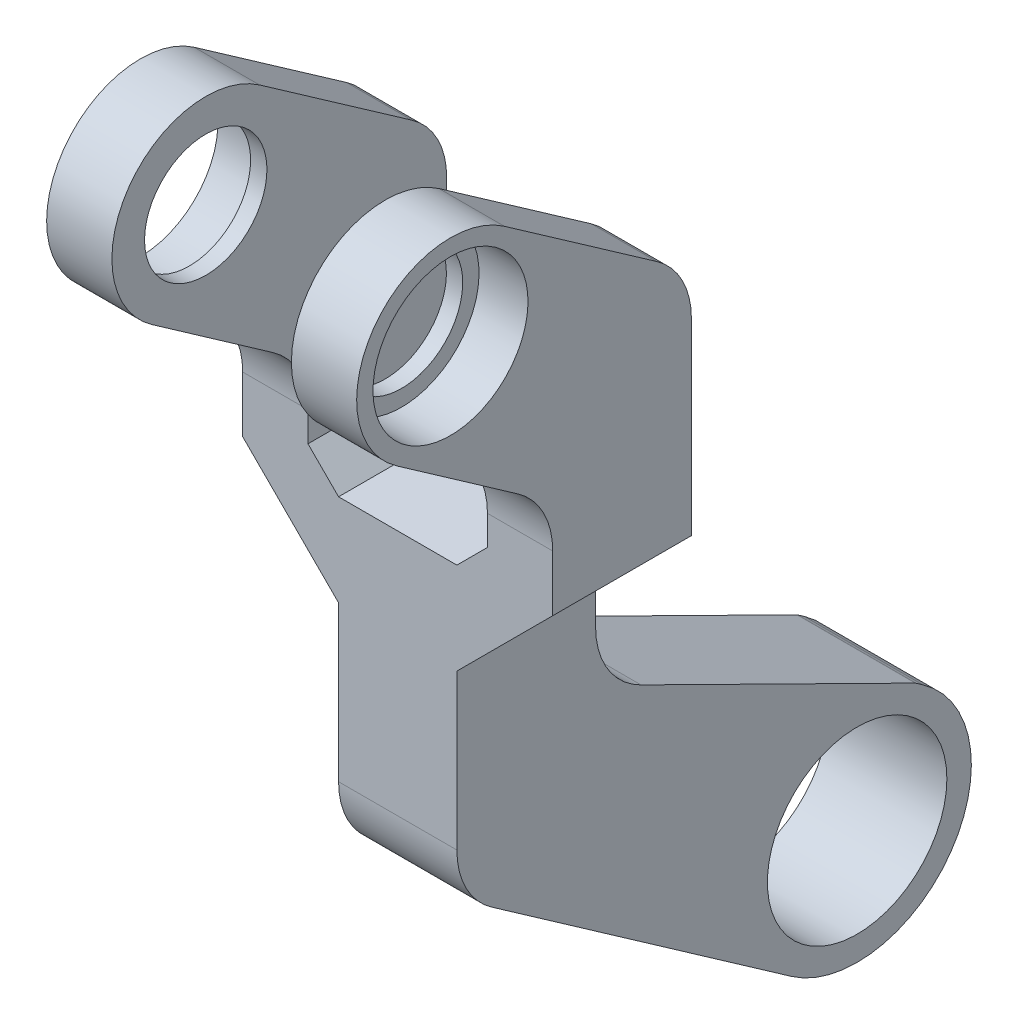
ISO-10303-21;
HEADER;
FILE_DESCRIPTION(('STEP AP214'),'2;1');
FILE_NAME('part.step','',(''),(''),'','','');
FILE_SCHEMA(('AUTOMOTIVE_DESIGN { 1 0 10303 214 1 1 1 1 }'));
ENDSEC;
DATA;
#1=APPLICATION_CONTEXT('core data for automotive mechanical design processes');
#2=APPLICATION_PROTOCOL_DEFINITION('international standard','automotive_design',2000,#1);
#3=PRODUCT_CONTEXT('',#1,'mechanical');
#4=PRODUCT('Part','Part','',(#3));
#5=PRODUCT_RELATED_PRODUCT_CATEGORY('part','',(#4));
#6=PRODUCT_DEFINITION_FORMATION('','',#4);
#7=PRODUCT_DEFINITION_CONTEXT('part definition',#1,'design');
#8=PRODUCT_DEFINITION('design','',#6,#7);
#9=PRODUCT_DEFINITION_SHAPE('','',#8);
#10=(LENGTH_UNIT() NAMED_UNIT(*) SI_UNIT(.MILLI.,.METRE.));
#11=(NAMED_UNIT(*) PLANE_ANGLE_UNIT() SI_UNIT($,.RADIAN.));
#12=(NAMED_UNIT(*) SI_UNIT($,.STERADIAN.) SOLID_ANGLE_UNIT());
#13=UNCERTAINTY_MEASURE_WITH_UNIT(LENGTH_MEASURE(1.E-05),#10,'distance_accuracy_value','');
#14=(GEOMETRIC_REPRESENTATION_CONTEXT(3) GLOBAL_UNCERTAINTY_ASSIGNED_CONTEXT((#13)) GLOBAL_UNIT_ASSIGNED_CONTEXT((#10,
#11,#12)) REPRESENTATION_CONTEXT('',''));
#15=CARTESIAN_POINT('',(0.,0.,0.));
#16=DIRECTION('',(0.,0.,1.));
#17=DIRECTION('',(1.,0.,0.));
#18=AXIS2_PLACEMENT_3D('',#15,#16,#17);
#19=CARTESIAN_POINT('',(-11.75,66.639891708506,29.5323862581288));
#20=DIRECTION('',(1.,0.,0.));
#21=DIRECTION('',(0.,1.,0.));
#22=AXIS2_PLACEMENT_3D('',#19,#20,#21);
#23=CYLINDRICAL_SURFACE('',#22,7.5);
#24=CARTESIAN_POINT('',(-3.75,66.639891708506,29.5323862581288));
#25=DIRECTION('',(-1.,0.,0.));
#26=DIRECTION('',(0.,-1.,0.));
#27=AXIS2_PLACEMENT_3D('',#24,#25,#26);
#28=CIRCLE('',#27,7.5);
#29=CARTESIAN_POINT('',(-3.75,59.139891708506,29.5323862581288));
#30=VERTEX_POINT('',#29);
#31=EDGE_CURVE('E322',#30,#30,#28,.F.);
#32=ORIENTED_EDGE('',*,*,#31,.T.);
#33=EDGE_LOOP('',(#32));
#34=FACE_BOUND('',#33,.T.);
#35=CARTESIAN_POINT('',(-5.74999999999999,66.639891708506,29.5323862581288));
#36=DIRECTION('',(-1.,0.,0.));
#37=DIRECTION('',(0.,0.,1.));
#38=AXIS2_PLACEMENT_3D('',#35,#36,#37);
#39=CIRCLE('',#38,7.5);
#40=CARTESIAN_POINT('',(-5.74999999999999,66.639891708506,37.0323862581288));
#41=VERTEX_POINT('',#40);
#42=EDGE_CURVE('E282',#41,#41,#39,.F.);
#43=ORIENTED_EDGE('',*,*,#42,.F.);
#44=EDGE_LOOP('',(#43));
#45=FACE_BOUND('',#44,.T.);
#46=ADVANCED_FACE('F35',(#34,#45),#23,.F.);
#47=CARTESIAN_POINT('',(18.25,66.639891708506,29.5323862581288));
#48=DIRECTION('',(1.,0.,0.));
#49=DIRECTION('',(0.,1.,0.));
#50=AXIS2_PLACEMENT_3D('',#47,#48,#49);
#51=CIRCLE('',#50,7.5);
#52=CARTESIAN_POINT('',(18.25,74.139891708506,29.5323862581288));
#53=VERTEX_POINT('',#52);
#54=EDGE_CURVE('E314',#53,#53,#51,.F.);
#55=ORIENTED_EDGE('',*,*,#54,.T.);
#56=EDGE_LOOP('',(#55));
#57=FACE_BOUND('',#56,.T.);
#58=CARTESIAN_POINT('',(20.25,66.639891708506,29.5323862581288));
#59=DIRECTION('',(1.,0.,0.));
#60=DIRECTION('',(0.,1.,0.));
#61=AXIS2_PLACEMENT_3D('',#58,#59,#60);
#62=CIRCLE('',#61,7.5);
#63=CARTESIAN_POINT('',(20.25,74.139891708506,29.5323862581288));
#64=VERTEX_POINT('',#63);
#65=EDGE_CURVE('E288',#64,#64,#62,.F.);
#66=ORIENTED_EDGE('',*,*,#65,.F.);
#67=EDGE_LOOP('',(#66));
#68=FACE_BOUND('',#67,.T.);
#69=ADVANCED_FACE('F524',(#57,#68),#23,.F.);
#70=CARTESIAN_POINT('',(-57.4788632095706,57.2196431991826,36.1285152761658));
#71=DIRECTION('',(0.,-0.819152044288989,0.57357643635105));
#72=DIRECTION('',(0.,-0.57357643635105,-0.819152044288989));
#73=AXIS2_PLACEMENT_3D('',#70,#71,#72);
#74=PLANE('',#73);
#75=DIRECTION('',(0.,0.57357643635105,0.819152044288989));
#76=VECTOR('',#75,1.);
#77=CARTESIAN_POINT('',(-11.75,57.2196431991826,36.1285152761658));
#78=LINE('',#77,#76);
#79=CARTESIAN_POINT('',(-11.75,46.8115625454241,21.2642356364895));
#80=VERTEX_POINT('',#79);
#81=CARTESIAN_POINT('',(-11.75,57.2196431991826,36.1285152761658));
#82=VERTEX_POINT('',#81);
#83=EDGE_CURVE('E336',#80,#82,#78,.T.);
#84=ORIENTED_EDGE('',*,*,#83,.F.);
#85=DIRECTION('',(1.,0.,0.));
#86=VECTOR('',#85,1.);
#87=CARTESIAN_POINT('',(-57.4788632095706,46.8115625454241,21.2642356364895));
#88=LINE('',#87,#86);
#89=CARTESIAN_POINT('',(-3.75,46.8115625454241,21.2642356364895));
#90=VERTEX_POINT('',#89);
#91=EDGE_CURVE('E444',#80,#90,#88,.T.);
#92=ORIENTED_EDGE('',*,*,#91,.T.);
#93=DIRECTION('',(0.,-0.57357643635105,-0.819152044288989));
#94=VECTOR('',#93,1.);
#95=CARTESIAN_POINT('',(-3.75,57.2196431991826,36.1285152761658));
#96=LINE('',#95,#94);
#97=CARTESIAN_POINT('',(-3.75,57.2196431991826,36.1285152761659));
#98=VERTEX_POINT('',#97);
#99=EDGE_CURVE('E327',#98,#90,#96,.T.);
#100=ORIENTED_EDGE('',*,*,#99,.F.);
#101=DIRECTION('',(1.,0.,0.));
#102=VECTOR('',#101,1.);
#103=CARTESIAN_POINT('',(-57.4788632095706,57.2196431991826,36.1285152761658));
#104=LINE('',#103,#102);
#105=EDGE_CURVE('E339',#82,#98,#104,.T.);
#106=ORIENTED_EDGE('',*,*,#105,.F.);
#107=EDGE_LOOP('',(#84,#92,#100,#106));
#108=FACE_BOUND('',#107,.T.);
#109=ADVANCED_FACE('F503',(#108),#74,.T.);
#110=CARTESIAN_POINT('',(-57.4788632095706,60.,0.));
#111=DIRECTION('',(0.,0.819152044288989,-0.57357643635105));
#112=DIRECTION('',(0.,0.57357643635105,0.819152044288989));
#113=AXIS2_PLACEMENT_3D('',#110,#111,#112);
#114=PLANE('',#113);
#115=DIRECTION('',(0.,0.57357643635105,0.819152044288989));
#116=VECTOR('',#115,1.);
#117=CARTESIAN_POINT('',(-3.75,60.,0.));
#118=LINE('',#117,#116);
#119=CARTESIAN_POINT('',(-3.75,62.9858499373725,4.2642356364895));
#120=VERTEX_POINT('',#119);
#121=CARTESIAN_POINT('',(-3.75,76.0601402178294,22.9362572400917));
#122=VERTEX_POINT('',#121);
#123=EDGE_CURVE('E325',#120,#122,#118,.T.);
#124=ORIENTED_EDGE('',*,*,#123,.F.);
#125=DIRECTION('',(-1.,0.,0.));
#126=VECTOR('',#125,1.);
#127=CARTESIAN_POINT('',(-11.75,62.9858499373725,4.2642356364895));
#128=LINE('',#127,#126);
#129=CARTESIAN_POINT('',(-11.75,62.9858499373725,4.2642356364895));
#130=VERTEX_POINT('',#129);
#131=EDGE_CURVE('E414',#120,#130,#128,.T.);
#132=ORIENTED_EDGE('',*,*,#131,.T.);
#133=DIRECTION('',(0.,-0.57357643635105,-0.819152044288989));
#134=VECTOR('',#133,1.);
#135=CARTESIAN_POINT('',(-11.75,60.,0.));
#136=LINE('',#135,#134);
#137=CARTESIAN_POINT('',(-11.75,76.0601402178294,22.9362572400917));
#138=VERTEX_POINT('',#137);
#139=EDGE_CURVE('E338',#138,#130,#136,.T.);
#140=ORIENTED_EDGE('',*,*,#139,.F.);
#141=DIRECTION('',(1.,0.,0.));
#142=VECTOR('',#141,1.);
#143=CARTESIAN_POINT('',(-57.4788632095706,76.0601402178294,22.9362572400917));
#144=LINE('',#143,#142);
#145=EDGE_CURVE('E348',#138,#122,#144,.T.);
#146=ORIENTED_EDGE('',*,*,#145,.T.);
#147=EDGE_LOOP('',(#124,#132,#140,#146));
#148=FACE_BOUND('',#147,.T.);
#149=ADVANCED_FACE('F490',(#148),#114,.T.);
#150=CARTESIAN_POINT('',(-39.4109233961791,66.639891708506,29.5323862581288));
#151=DIRECTION('',(1.,0.,0.));
#152=DIRECTION('',(0.,1.,0.));
#153=AXIS2_PLACEMENT_3D('',#150,#151,#152);
#154=CYLINDRICAL_SURFACE('',#153,11.5);
#155=CARTESIAN_POINT('',(-3.75,66.639891708506,29.5323862581288));
#156=DIRECTION('',(-1.,0.,0.));
#157=DIRECTION('',(0.,-1.,0.));
#158=AXIS2_PLACEMENT_3D('',#155,#156,#157);
#159=CIRCLE('',#158,11.5);
#160=EDGE_CURVE('E323',#122,#98,#159,.F.);
#161=ORIENTED_EDGE('',*,*,#160,.F.);
#162=ORIENTED_EDGE('',*,*,#145,.F.);
#163=CARTESIAN_POINT('',(-11.75,66.639891708506,29.5323862581288));
#164=DIRECTION('',(1.,0.,0.));
#165=DIRECTION('',(0.,1.,0.));
#166=AXIS2_PLACEMENT_3D('',#163,#164,#165);
#167=CIRCLE('',#166,11.5);
#168=EDGE_CURVE('E331',#82,#138,#167,.F.);
#169=ORIENTED_EDGE('',*,*,#168,.F.);
#170=ORIENTED_EDGE('',*,*,#105,.T.);
#171=EDGE_LOOP('',(#161,#162,#169,#170));
#172=FACE_BOUND('',#171,.T.);
#173=ADVANCED_FACE('F498',(#172),#154,.T.);
#174=CARTESIAN_POINT('',(0.,20.,23.));
#175=DIRECTION('',(1.,0.,0.));
#176=DIRECTION('',(0.,1.,0.));
#177=AXIS2_PLACEMENT_3D('',#174,#175,#176);
#178=PLANE('',#177);
#179=CARTESIAN_POINT('',(0.,-21.4642354068717,-32.0623601512637));
#180=DIRECTION('',(1.,0.,0.));
#181=DIRECTION('',(0.,1.,0.));
#182=AXIS2_PLACEMENT_3D('',#179,#180,#181);
#183=CIRCLE('',#182,11.);
#184=CARTESIAN_POINT('',(0.,-10.4642354068717,-32.0623601512637));
#185=VERTEX_POINT('',#184);
#186=EDGE_CURVE('E295',#185,#185,#183,.F.);
#187=ORIENTED_EDGE('',*,*,#186,.F.);
#188=EDGE_LOOP('',(#187));
#189=FACE_BOUND('',#188,.T.);
#190=DIRECTION('',(0.,0.573576436351038,0.819152044288998));
#191=VECTOR('',#190,1.);
#192=CARTESIAN_POINT('',(0.,0.,23.));
#193=LINE('',#192,#191);
#194=CARTESIAN_POINT('',(0.,-32.9323640269177,-24.0322900423492));
#195=VERTEX_POINT('',#194);
#196=CARTESIAN_POINT('',(0.,-7.18709516663062,12.7357643635104));
#197=VERTEX_POINT('',#196);
#198=EDGE_CURVE('E305',#195,#197,#193,.T.);
#199=ORIENTED_EDGE('',*,*,#198,.T.);
#200=CARTESIAN_POINT('',(0.,1.00442527625935,7.));
#201=DIRECTION('',(1.,0.,0.));
#202=DIRECTION('',(0.,1.,0.));
#203=AXIS2_PLACEMENT_3D('',#200,#201,#202);
#204=CIRCLE('',#203,10.);
#205=CARTESIAN_POINT('',(0.,1.00442527625935,17.));
#206=VERTEX_POINT('',#205);
#207=EDGE_CURVE('E450',#197,#206,#204,.F.);
#208=ORIENTED_EDGE('',*,*,#207,.T.);
#209=DIRECTION('',(0.,1.,0.));
#210=VECTOR('',#209,1.);
#211=CARTESIAN_POINT('',(0.,20.,17.));
#212=LINE('',#211,#210);
#213=CARTESIAN_POINT('',(0.,20.,17.));
#214=VERTEX_POINT('',#213);
#215=EDGE_CURVE('E253',#206,#214,#212,.T.);
#216=ORIENTED_EDGE('',*,*,#215,.T.);
#217=DIRECTION('',(0.,0.,-1.));
#218=VECTOR('',#217,1.);
#219=CARTESIAN_POINT('',(0.,20.,23.));
#220=LINE('',#219,#218);
#221=CARTESIAN_POINT('',(0.,20.,0.));
#222=VERTEX_POINT('',#221);
#223=EDGE_CURVE('E389',#214,#222,#220,.T.);
#224=ORIENTED_EDGE('',*,*,#223,.T.);
#225=DIRECTION('',(0.,-1.,0.));
#226=VECTOR('',#225,1.);
#227=CARTESIAN_POINT('',(0.,20.,0.));
#228=LINE('',#227,#226);
#229=CARTESIAN_POINT('',(0.,16.2121311990158,0.));
#230=VERTEX_POINT('',#229);
#231=EDGE_CURVE('E366',#222,#230,#228,.T.);
#232=ORIENTED_EDGE('',*,*,#231,.T.);
#233=CARTESIAN_POINT('',(0.,16.2121311990158,-10.));
#234=DIRECTION('',(1.,0.,0.));
#235=DIRECTION('',(0.,1.,0.));
#236=AXIS2_PLACEMENT_3D('',#233,#234,#235);
#237=CIRCLE('',#236,10.);
#238=CARTESIAN_POINT('',(0.,7.24740723806097,-5.56900414084125));
#239=VERTEX_POINT('',#238);
#240=EDGE_CURVE('E11',#230,#239,#237,.T.);
#241=ORIENTED_EDGE('',*,*,#240,.T.);
#242=DIRECTION('',(0.,-0.443099585915876,-0.896472396095485));
#243=VECTOR('',#242,1.);
#244=CARTESIAN_POINT('',(0.,21.0995830227714,22.4565088850563));
#245=LINE('',#244,#243);
#246=CARTESIAN_POINT('',(0.,-9.37309394782038,-39.1953513458772));
#247=VERTEX_POINT('',#246);
#248=EDGE_CURVE('E246',#239,#247,#245,.T.);
#249=ORIENTED_EDGE('',*,*,#248,.T.);
#250=CARTESIAN_POINT('',(0.,-21.4642354068717,-32.0623601512637));
#251=DIRECTION('',(1.,0.,0.));
#252=DIRECTION('',(0.,1.,0.));
#253=AXIS2_PLACEMENT_3D('',#250,#251,#252);
#254=CIRCLE('',#253,14.038349802068);
#255=CARTESIAN_POINT('',(0.,-9.40133673911819,-39.2430106020748));
#256=VERTEX_POINT('',#255);
#257=EDGE_CURVE('E236',#247,#256,#254,.F.);
#258=ORIENTED_EDGE('',*,*,#257,.T.);
#259=DIRECTION('',(0.,-0.573576436351037,-0.819152044288998));
#260=VECTOR('',#259,1.);
#261=CARTESIAN_POINT('',(0.,18.0769151064975,0.));
#262=LINE('',#261,#260);
#263=CARTESIAN_POINT('',(0.,-9.99610678682573,-40.0924302601782));
#264=VERTEX_POINT('',#263);
#265=EDGE_CURVE('E303',#256,#264,#262,.T.);
#266=ORIENTED_EDGE('',*,*,#265,.T.);
#267=CARTESIAN_POINT('',(0.,-21.4642354068717,-32.0623601512637));
#268=DIRECTION('',(1.,0.,0.));
#269=DIRECTION('',(0.,1.,0.));
#270=AXIS2_PLACEMENT_3D('',#267,#268,#269);
#271=CIRCLE('',#270,14.);
#272=EDGE_CURVE('E299',#264,#195,#271,.F.);
#273=ORIENTED_EDGE('',*,*,#272,.T.);
#274=EDGE_LOOP('',(#199,#208,#216,#224,#232,#241,#249,#258,#266,#273));
#275=FACE_BOUND('',#274,.T.);
#276=ADVANCED_FACE('F472',(#189,#275),#178,.F.);
#277=CARTESIAN_POINT('',(14.5,0.,23.));
#278=DIRECTION('',(-1.,0.,0.));
#279=DIRECTION('',(0.,-1.,0.));
#280=AXIS2_PLACEMENT_3D('',#277,#278,#279);
#281=PLANE('',#280);
#282=CARTESIAN_POINT('',(14.5,-21.4642354068717,-32.0623601512637));
#283=DIRECTION('',(1.,0.,0.));
#284=DIRECTION('',(0.,0.,-1.));
#285=AXIS2_PLACEMENT_3D('',#282,#283,#284);
#286=CIRCLE('',#285,11.);
#287=CARTESIAN_POINT('',(14.5,-21.4642354068717,-43.0623601512637));
#288=VERTEX_POINT('',#287);
#289=EDGE_CURVE('E292',#288,#288,#286,.T.);
#290=ORIENTED_EDGE('',*,*,#289,.F.);
#291=EDGE_LOOP('',(#290));
#292=FACE_BOUND('',#291,.T.);
#293=DIRECTION('',(0.,-1.,0.));
#294=VECTOR('',#293,1.);
#295=CARTESIAN_POINT('',(14.5,0.,17.));
#296=LINE('',#295,#294);
#297=CARTESIAN_POINT('',(14.5,20.,17.));
#298=VERTEX_POINT('',#297);
#299=CARTESIAN_POINT('',(14.5,1.00442527625935,17.));
#300=VERTEX_POINT('',#299);
#301=EDGE_CURVE('E251',#298,#300,#296,.T.);
#302=ORIENTED_EDGE('',*,*,#301,.T.);
#303=CARTESIAN_POINT('',(14.5,1.00442527625935,7.));
#304=DIRECTION('',(-1.,0.,0.));
#305=DIRECTION('',(0.,-1.,0.));
#306=AXIS2_PLACEMENT_3D('',#303,#304,#305);
#307=CIRCLE('',#306,10.);
#308=CARTESIAN_POINT('',(14.5,-7.18709516663062,12.7357643635104));
#309=VERTEX_POINT('',#308);
#310=EDGE_CURVE('E58',#300,#309,#307,.F.);
#311=ORIENTED_EDGE('',*,*,#310,.T.);
#312=DIRECTION('',(0.,-0.573576436351038,-0.819152044288998));
#313=VECTOR('',#312,1.);
#314=CARTESIAN_POINT('',(14.5,0.,23.));
#315=LINE('',#314,#313);
#316=CARTESIAN_POINT('',(14.5,-32.9323640269177,-24.0322900423492));
#317=VERTEX_POINT('',#316);
#318=EDGE_CURVE('E301',#309,#317,#315,.T.);
#319=ORIENTED_EDGE('',*,*,#318,.T.);
#320=CARTESIAN_POINT('',(14.5,-21.4642354068717,-32.0623601512637));
#321=DIRECTION('',(1.,0.,0.));
#322=DIRECTION('',(0.,0.,1.));
#323=AXIS2_PLACEMENT_3D('',#320,#321,#322);
#324=CIRCLE('',#323,14.);
#325=CARTESIAN_POINT('',(14.5,-9.99610678682573,-40.0924302601782));
#326=VERTEX_POINT('',#325);
#327=EDGE_CURVE('E298',#317,#326,#324,.T.);
#328=ORIENTED_EDGE('',*,*,#327,.T.);
#329=DIRECTION('',(0.,0.573576436351037,0.819152044288998));
#330=VECTOR('',#329,1.);
#331=CARTESIAN_POINT('',(14.5,18.0769151064975,0.));
#332=LINE('',#331,#330);
#333=CARTESIAN_POINT('',(14.5,-9.40133673911815,-39.2430106020747));
#334=VERTEX_POINT('',#333);
#335=EDGE_CURVE('E242',#326,#334,#332,.T.);
#336=ORIENTED_EDGE('',*,*,#335,.T.);
#337=CARTESIAN_POINT('',(14.5,-21.4642354068717,-32.0623601512637));
#338=DIRECTION('',(-1.,0.,0.));
#339=DIRECTION('',(0.,1.,0.));
#340=AXIS2_PLACEMENT_3D('',#337,#338,#339);
#341=CIRCLE('',#340,14.038349802068);
#342=CARTESIAN_POINT('',(14.5,-9.37309394782038,-39.1953513458772));
#343=VERTEX_POINT('',#342);
#344=EDGE_CURVE('E229',#343,#334,#341,.T.);
#345=ORIENTED_EDGE('',*,*,#344,.F.);
#346=DIRECTION('',(0.,-0.443099585915876,-0.896472396095484));
#347=VECTOR('',#346,1.);
#348=CARTESIAN_POINT('',(14.5,9.99999999999999,0.));
#349=LINE('',#348,#347);
#350=CARTESIAN_POINT('',(14.5,7.24740723806098,-5.56900414084124));
#351=VERTEX_POINT('',#350);
#352=EDGE_CURVE('E221',#351,#343,#349,.T.);
#353=ORIENTED_EDGE('',*,*,#352,.F.);
#354=CARTESIAN_POINT('',(14.5,16.2121311990158,-10.));
#355=DIRECTION('',(-1.,0.,0.));
#356=DIRECTION('',(0.,-1.,0.));
#357=AXIS2_PLACEMENT_3D('',#354,#355,#356);
#358=CIRCLE('',#357,10.);
#359=CARTESIAN_POINT('',(14.5,16.2121311990158,0.));
#360=VERTEX_POINT('',#359);
#361=EDGE_CURVE('E43',#351,#360,#358,.T.);
#362=ORIENTED_EDGE('',*,*,#361,.T.);
#363=DIRECTION('',(0.,1.,0.));
#364=VECTOR('',#363,1.);
#365=CARTESIAN_POINT('',(14.5,0.,0.));
#366=LINE('',#365,#364);
#367=CARTESIAN_POINT('',(14.5,20.,0.));
#368=VERTEX_POINT('',#367);
#369=EDGE_CURVE('E371',#360,#368,#366,.T.);
#370=ORIENTED_EDGE('',*,*,#369,.T.);
#371=DIRECTION('',(0.,0.,-1.));
#372=VECTOR('',#371,1.);
#373=CARTESIAN_POINT('',(14.5,20.,23.));
#374=LINE('',#373,#372);
#375=EDGE_CURVE('E401',#298,#368,#374,.T.);
#376=ORIENTED_EDGE('',*,*,#375,.F.);
#377=EDGE_LOOP('',(#302,#311,#319,#328,#336,#345,#353,#362,#370,#376));
#378=FACE_BOUND('',#377,.T.);
#379=ADVANCED_FACE('F239',(#292,#378),#281,.F.);
#380=CARTESIAN_POINT('',(14.5,20.,23.));
#381=DIRECTION('',(-0.707106781186546,0.707106781186549,0.));
#382=DIRECTION('',(-0.707106781186549,-0.707106781186546,0.));
#383=AXIS2_PLACEMENT_3D('',#380,#381,#382);
#384=PLANE('',#383);
#385=DIRECTION('',(0.,0.,-1.));
#386=VECTOR('',#385,1.);
#387=CARTESIAN_POINT('',(26.25,31.75,23.));
#388=LINE('',#387,#386);
#389=CARTESIAN_POINT('',(26.25,31.75,17.));
#390=VERTEX_POINT('',#389);
#391=CARTESIAN_POINT('',(26.25,31.75,0.));
#392=VERTEX_POINT('',#391);
#393=EDGE_CURVE('E399',#390,#392,#388,.T.);
#394=ORIENTED_EDGE('',*,*,#393,.F.);
#395=DIRECTION('',(-0.707106781186549,-0.707106781186546,0.));
#396=VECTOR('',#395,1.);
#397=CARTESIAN_POINT('',(14.5,20.,17.));
#398=LINE('',#397,#396);
#399=EDGE_CURVE('E261',#390,#298,#398,.T.);
#400=ORIENTED_EDGE('',*,*,#399,.T.);
#401=ORIENTED_EDGE('',*,*,#375,.T.);
#402=DIRECTION('',(0.707106781186549,0.707106781186546,0.));
#403=VECTOR('',#402,1.);
#404=CARTESIAN_POINT('',(14.5,20.,0.));
#405=LINE('',#404,#403);
#406=EDGE_CURVE('E373',#368,#392,#405,.T.);
#407=ORIENTED_EDGE('',*,*,#406,.T.);
#408=EDGE_LOOP('',(#394,#400,#401,#407));
#409=FACE_BOUND('',#408,.T.);
#410=ADVANCED_FACE('F577',(#409),#384,.F.);
#411=CARTESIAN_POINT('',(26.25,31.75,23.));
#412=DIRECTION('',(-1.,0.,0.));
#413=DIRECTION('',(0.,-1.,0.));
#414=AXIS2_PLACEMENT_3D('',#411,#412,#413);
#415=PLANE('',#414);
#416=CARTESIAN_POINT('',(26.25,66.639891708506,29.5323862581288));
#417=DIRECTION('',(1.,0.,0.));
#418=DIRECTION('',(0.,1.,0.));
#419=AXIS2_PLACEMENT_3D('',#416,#417,#418);
#420=CIRCLE('',#419,9.50000000000001);
#421=CARTESIAN_POINT('',(26.25,76.139891708506,29.5323862581288));
#422=VERTEX_POINT('',#421);
#423=EDGE_CURVE('E289',#422,#422,#420,.T.);
#424=ORIENTED_EDGE('',*,*,#423,.F.);
#425=EDGE_LOOP('',(#424));
#426=FACE_BOUND('',#425,.T.);
#427=DIRECTION('',(0.,1.,0.));
#428=VECTOR('',#427,1.);
#429=CARTESIAN_POINT('',(26.25,31.75,0.));
#430=LINE('',#429,#428);
#431=CARTESIAN_POINT('',(26.25,54.7943294944826,0.));
#432=VERTEX_POINT('',#431);
#433=EDGE_CURVE('E376',#392,#432,#430,.T.);
#434=ORIENTED_EDGE('',*,*,#433,.T.);
#435=CARTESIAN_POINT('',(26.25,54.7943294944826,10.));
#436=DIRECTION('',(-1.,0.,0.));
#437=DIRECTION('',(0.,-1.,0.));
#438=AXIS2_PLACEMENT_3D('',#435,#436,#437);
#439=CIRCLE('',#438,10.);
#440=CARTESIAN_POINT('',(26.25,62.9858499373725,4.2642356364895));
#441=VERTEX_POINT('',#440);
#442=EDGE_CURVE('E432',#432,#441,#439,.F.);
#443=ORIENTED_EDGE('',*,*,#442,.T.);
#444=DIRECTION('',(0.,0.57357643635105,0.819152044288989));
#445=VECTOR('',#444,1.);
#446=CARTESIAN_POINT('',(26.25,60.,0.));
#447=LINE('',#446,#445);
#448=CARTESIAN_POINT('',(26.25,76.0601402178294,22.9362572400917));
#449=VERTEX_POINT('',#448);
#450=EDGE_CURVE('E333',#441,#449,#447,.T.);
#451=ORIENTED_EDGE('',*,*,#450,.T.);
#452=CARTESIAN_POINT('',(26.25,66.639891708506,29.5323862581288));
#453=DIRECTION('',(1.,0.,0.));
#454=DIRECTION('',(0.,1.,0.));
#455=AXIS2_PLACEMENT_3D('',#452,#453,#454);
#456=CIRCLE('',#455,11.5);
#457=CARTESIAN_POINT('',(26.25,57.2196431991826,36.1285152761658));
#458=VERTEX_POINT('',#457);
#459=EDGE_CURVE('E330',#449,#458,#456,.T.);
#460=ORIENTED_EDGE('',*,*,#459,.T.);
#461=DIRECTION('',(0.,-0.57357643635105,-0.819152044288989));
#462=VECTOR('',#461,1.);
#463=CARTESIAN_POINT('',(26.25,57.2196431991826,36.1285152761658));
#464=LINE('',#463,#462);
#465=CARTESIAN_POINT('',(26.25,46.8115625454241,21.2642356364895));
#466=VERTEX_POINT('',#465);
#467=EDGE_CURVE('E341',#458,#466,#464,.T.);
#468=ORIENTED_EDGE('',*,*,#467,.T.);
#469=CARTESIAN_POINT('',(26.25,38.6200421025342,27.));
#470=DIRECTION('',(-1.,0.,0.));
#471=DIRECTION('',(0.,-1.,0.));
#472=AXIS2_PLACEMENT_3D('',#469,#470,#471);
#473=CIRCLE('',#472,10.);
#474=CARTESIAN_POINT('',(26.25,38.6200421025342,17.));
#475=VERTEX_POINT('',#474);
#476=EDGE_CURVE('E452',#466,#475,#473,.T.);
#477=ORIENTED_EDGE('',*,*,#476,.T.);
#478=DIRECTION('',(0.,1.,0.));
#479=VECTOR('',#478,1.);
#480=CARTESIAN_POINT('',(26.25,43.8257126080516,17.));
#481=LINE('',#480,#479);
#482=EDGE_CURVE('E248',#390,#475,#481,.T.);
#483=ORIENTED_EDGE('',*,*,#482,.F.);
#484=ORIENTED_EDGE('',*,*,#393,.T.);
#485=EDGE_LOOP('',(#434,#443,#451,#460,#468,#477,#483,#484));
#486=FACE_BOUND('',#485,.T.);
#487=ADVANCED_FACE('F573',(#426,#486),#415,.F.);
#488=CARTESIAN_POINT('',(18.25,60.,23.));
#489=DIRECTION('',(1.,0.,0.));
#490=DIRECTION('',(0.,0.,-1.));
#491=AXIS2_PLACEMENT_3D('',#488,#489,#490);
#492=PLANE('',#491);
#493=DIRECTION('',(0.,-0.57357643635105,-0.819152044288989));
#494=VECTOR('',#493,1.);
#495=CARTESIAN_POINT('',(18.25,60.,0.));
#496=LINE('',#495,#494);
#497=CARTESIAN_POINT('',(18.25,76.0601402178294,22.9362572400917));
#498=VERTEX_POINT('',#497);
#499=CARTESIAN_POINT('',(18.25,62.9858499373725,4.2642356364895));
#500=VERTEX_POINT('',#499);
#501=EDGE_CURVE('E317',#498,#500,#496,.T.);
#502=ORIENTED_EDGE('',*,*,#501,.T.);
#503=CARTESIAN_POINT('',(18.25,54.7943294944826,10.));
#504=DIRECTION('',(1.,0.,0.));
#505=DIRECTION('',(0.,0.,-1.));
#506=AXIS2_PLACEMENT_3D('',#503,#504,#505);
#507=CIRCLE('',#506,10.);
#508=CARTESIAN_POINT('',(18.25,54.7943294944826,0.));
#509=VERTEX_POINT('',#508);
#510=EDGE_CURVE('E430',#500,#509,#507,.F.);
#511=ORIENTED_EDGE('',*,*,#510,.T.);
#512=DIRECTION('',(0.,-1.,0.));
#513=VECTOR('',#512,1.);
#514=CARTESIAN_POINT('',(18.25,60.,0.));
#515=LINE('',#514,#513);
#516=CARTESIAN_POINT('',(18.25,35.,0.));
#517=VERTEX_POINT('',#516);
#518=EDGE_CURVE('E379',#509,#517,#515,.T.);
#519=ORIENTED_EDGE('',*,*,#518,.T.);
#520=DIRECTION('',(0.,0.,-1.));
#521=VECTOR('',#520,1.);
#522=CARTESIAN_POINT('',(18.25,35.,23.));
#523=LINE('',#522,#521);
#524=CARTESIAN_POINT('',(18.25,35.,17.));
#525=VERTEX_POINT('',#524);
#526=EDGE_CURVE('E396',#525,#517,#523,.T.);
#527=ORIENTED_EDGE('',*,*,#526,.F.);
#528=DIRECTION('',(0.,1.,0.));
#529=VECTOR('',#528,1.);
#530=CARTESIAN_POINT('',(18.25,60.,17.));
#531=LINE('',#530,#529);
#532=CARTESIAN_POINT('',(18.25,38.6200421025342,17.));
#533=VERTEX_POINT('',#532);
#534=EDGE_CURVE('E275',#525,#533,#531,.T.);
#535=ORIENTED_EDGE('',*,*,#534,.T.);
#536=CARTESIAN_POINT('',(18.25,38.6200421025342,27.));
#537=DIRECTION('',(1.,0.,0.));
#538=DIRECTION('',(0.,0.,-1.));
#539=AXIS2_PLACEMENT_3D('',#536,#537,#538);
#540=CIRCLE('',#539,10.);
#541=CARTESIAN_POINT('',(18.25,46.8115625454241,21.2642356364895));
#542=VERTEX_POINT('',#541);
#543=EDGE_CURVE('E454',#533,#542,#540,.T.);
#544=ORIENTED_EDGE('',*,*,#543,.T.);
#545=DIRECTION('',(0.,0.57357643635105,0.819152044288989));
#546=VECTOR('',#545,1.);
#547=CARTESIAN_POINT('',(18.25,57.2196431991826,36.1285152761658));
#548=LINE('',#547,#546);
#549=CARTESIAN_POINT('',(18.25,57.2196431991826,36.1285152761658));
#550=VERTEX_POINT('',#549);
#551=EDGE_CURVE('E320',#542,#550,#548,.T.);
#552=ORIENTED_EDGE('',*,*,#551,.T.);
#553=CARTESIAN_POINT('',(18.25,66.639891708506,29.5323862581288));
#554=DIRECTION('',(1.,0.,0.));
#555=DIRECTION('',(0.,1.,0.));
#556=AXIS2_PLACEMENT_3D('',#553,#554,#555);
#557=CIRCLE('',#556,11.5);
#558=EDGE_CURVE('E315',#550,#498,#557,.F.);
#559=ORIENTED_EDGE('',*,*,#558,.T.);
#560=EDGE_LOOP('',(#502,#511,#519,#527,#535,#544,#552,#559));
#561=FACE_BOUND('',#560,.T.);
#562=ORIENTED_EDGE('',*,*,#54,.F.);
#563=EDGE_LOOP('',(#562));
#564=FACE_BOUND('',#563,.T.);
#565=ADVANCED_FACE('F570',(#561,#564),#492,.F.);
#566=CARTESIAN_POINT('',(-3.75,35.,23.));
#567=DIRECTION('',(-1.,0.,0.));
#568=DIRECTION('',(0.,0.,1.));
#569=AXIS2_PLACEMENT_3D('',#566,#567,#568);
#570=PLANE('',#569);
#571=DIRECTION('',(0.,1.,0.));
#572=VECTOR('',#571,1.);
#573=CARTESIAN_POINT('',(-3.75,35.,0.));
#574=LINE('',#573,#572);
#575=CARTESIAN_POINT('',(-3.75,35.,0.));
#576=VERTEX_POINT('',#575);
#577=CARTESIAN_POINT('',(-3.75,54.7943294944826,0.));
#578=VERTEX_POINT('',#577);
#579=EDGE_CURVE('E381',#576,#578,#574,.T.);
#580=ORIENTED_EDGE('',*,*,#579,.T.);
#581=CARTESIAN_POINT('',(-3.75,54.7943294944826,10.));
#582=DIRECTION('',(-1.,0.,0.));
#583=DIRECTION('',(0.,0.,1.));
#584=AXIS2_PLACEMENT_3D('',#581,#582,#583);
#585=CIRCLE('',#584,10.);
#586=EDGE_CURVE('E425',#578,#120,#585,.F.);
#587=ORIENTED_EDGE('',*,*,#586,.T.);
#588=ORIENTED_EDGE('',*,*,#123,.T.);
#589=ORIENTED_EDGE('',*,*,#160,.T.);
#590=ORIENTED_EDGE('',*,*,#99,.T.);
#591=CARTESIAN_POINT('',(-3.75,38.6200421025342,27.));
#592=DIRECTION('',(-1.,0.,0.));
#593=DIRECTION('',(0.,0.,1.));
#594=AXIS2_PLACEMENT_3D('',#591,#592,#593);
#595=CIRCLE('',#594,10.);
#596=CARTESIAN_POINT('',(-3.75,38.6200421025342,17.));
#597=VERTEX_POINT('',#596);
#598=EDGE_CURVE('E456',#90,#597,#595,.T.);
#599=ORIENTED_EDGE('',*,*,#598,.T.);
#600=DIRECTION('',(0.,-1.,0.));
#601=VECTOR('',#600,1.);
#602=CARTESIAN_POINT('',(-3.75,35.,17.));
#603=LINE('',#602,#601);
#604=CARTESIAN_POINT('',(-3.75,35.,17.));
#605=VERTEX_POINT('',#604);
#606=EDGE_CURVE('E273',#597,#605,#603,.T.);
#607=ORIENTED_EDGE('',*,*,#606,.T.);
#608=DIRECTION('',(0.,0.,-1.));
#609=VECTOR('',#608,1.);
#610=CARTESIAN_POINT('',(-3.75,35.,23.));
#611=LINE('',#610,#609);
#612=EDGE_CURVE('E394',#605,#576,#611,.T.);
#613=ORIENTED_EDGE('',*,*,#612,.T.);
#614=EDGE_LOOP('',(#580,#587,#588,#589,#590,#599,#607,#613));
#615=FACE_BOUND('',#614,.T.);
#616=ORIENTED_EDGE('',*,*,#31,.F.);
#617=EDGE_LOOP('',(#616));
#618=FACE_BOUND('',#617,.T.);
#619=ADVANCED_FACE('F494',(#615,#618),#570,.F.);
#620=CARTESIAN_POINT('',(-11.75,60.,23.));
#621=DIRECTION('',(1.,0.,0.));
#622=DIRECTION('',(0.,1.,0.));
#623=AXIS2_PLACEMENT_3D('',#620,#621,#622);
#624=PLANE('',#623);
#625=CARTESIAN_POINT('',(-11.75,66.639891708506,29.5323862581288));
#626=DIRECTION('',(-1.,0.,0.));
#627=DIRECTION('',(0.,0.,1.));
#628=AXIS2_PLACEMENT_3D('',#625,#626,#627);
#629=CIRCLE('',#628,9.50000000000001);
#630=CARTESIAN_POINT('',(-11.75,66.639891708506,39.0323862581288));
#631=VERTEX_POINT('',#630);
#632=EDGE_CURVE('E278',#631,#631,#629,.T.);
#633=ORIENTED_EDGE('',*,*,#632,.F.);
#634=EDGE_LOOP('',(#633));
#635=FACE_BOUND('',#634,.T.);
#636=ORIENTED_EDGE('',*,*,#139,.T.);
#637=CARTESIAN_POINT('',(-11.75,54.7943294944826,10.));
#638=DIRECTION('',(1.,0.,0.));
#639=DIRECTION('',(0.,1.,0.));
#640=AXIS2_PLACEMENT_3D('',#637,#638,#639);
#641=CIRCLE('',#640,10.);
#642=CARTESIAN_POINT('',(-11.75,54.7943294944826,0.));
#643=VERTEX_POINT('',#642);
#644=EDGE_CURVE('E417',#130,#643,#641,.F.);
#645=ORIENTED_EDGE('',*,*,#644,.T.);
#646=DIRECTION('',(0.,-1.,0.));
#647=VECTOR('',#646,1.);
#648=CARTESIAN_POINT('',(-11.75,60.,0.));
#649=LINE('',#648,#647);
#650=CARTESIAN_POINT('',(-11.75,31.7500000000001,0.));
#651=VERTEX_POINT('',#650);
#652=EDGE_CURVE('E384',#643,#651,#649,.T.);
#653=ORIENTED_EDGE('',*,*,#652,.T.);
#654=DIRECTION('',(0.,0.,-1.));
#655=VECTOR('',#654,1.);
#656=CARTESIAN_POINT('',(-11.75,31.7500000000001,23.));
#657=LINE('',#656,#655);
#658=CARTESIAN_POINT('',(-11.75,31.7500000000001,17.));
#659=VERTEX_POINT('',#658);
#660=EDGE_CURVE('E391',#659,#651,#657,.T.);
#661=ORIENTED_EDGE('',*,*,#660,.F.);
#662=DIRECTION('',(0.,1.,0.));
#663=VECTOR('',#662,1.);
#664=CARTESIAN_POINT('',(-11.75,60.,17.));
#665=LINE('',#664,#663);
#666=CARTESIAN_POINT('',(-11.75,38.6200421025342,17.));
#667=VERTEX_POINT('',#666);
#668=EDGE_CURVE('E258',#659,#667,#665,.T.);
#669=ORIENTED_EDGE('',*,*,#668,.T.);
#670=CARTESIAN_POINT('',(-11.75,38.6200421025342,27.));
#671=DIRECTION('',(1.,0.,0.));
#672=DIRECTION('',(0.,1.,0.));
#673=AXIS2_PLACEMENT_3D('',#670,#671,#672);
#674=CIRCLE('',#673,10.);
#675=EDGE_CURVE('E458',#667,#80,#674,.T.);
#676=ORIENTED_EDGE('',*,*,#675,.T.);
#677=ORIENTED_EDGE('',*,*,#83,.T.);
#678=ORIENTED_EDGE('',*,*,#168,.T.);
#679=EDGE_LOOP('',(#636,#645,#653,#661,#669,#676,#677,#678));
#680=FACE_BOUND('',#679,.T.);
#681=ADVANCED_FACE('F481',(#635,#680),#624,.F.);
#682=CARTESIAN_POINT('',(0.,20.,23.));
#683=DIRECTION('',(0.707106781186551,0.707106781186544,0.));
#684=DIRECTION('',(-0.707106781186544,0.707106781186551,0.));
#685=AXIS2_PLACEMENT_3D('',#682,#683,#684);
#686=PLANE('',#685);
#687=ORIENTED_EDGE('',*,*,#223,.F.);
#688=DIRECTION('',(-0.707106781186544,0.707106781186551,0.));
#689=VECTOR('',#688,1.);
#690=CARTESIAN_POINT('',(0.,20.,17.));
#691=LINE('',#690,#689);
#692=EDGE_CURVE('E255',#214,#659,#691,.T.);
#693=ORIENTED_EDGE('',*,*,#692,.T.);
#694=ORIENTED_EDGE('',*,*,#660,.T.);
#695=DIRECTION('',(0.707106781186544,-0.707106781186551,0.));
#696=VECTOR('',#695,1.);
#697=CARTESIAN_POINT('',(0.,20.,0.));
#698=LINE('',#697,#696);
#699=EDGE_CURVE('E386',#651,#222,#698,.T.);
#700=ORIENTED_EDGE('',*,*,#699,.T.);
#701=EDGE_LOOP('',(#687,#693,#694,#700));
#702=FACE_BOUND('',#701,.T.);
#703=ADVANCED_FACE('F477',(#702),#686,.F.);
#704=CARTESIAN_POINT('',(0.,0.,0.));
#705=DIRECTION('',(0.,0.,1.));
#706=DIRECTION('',(1.,0.,0.));
#707=AXIS2_PLACEMENT_3D('',#704,#705,#706);
#708=PLANE('',#707);
#709=ORIENTED_EDGE('',*,*,#652,.F.);
#710=DIRECTION('',(-1.,0.,0.));
#711=VECTOR('',#710,1.);
#712=CARTESIAN_POINT('',(-3.75,54.7943294944826,0.));
#713=LINE('',#712,#711);
#714=EDGE_CURVE('E423',#643,#578,#713,.F.);
#715=ORIENTED_EDGE('',*,*,#714,.T.);
#716=ORIENTED_EDGE('',*,*,#579,.F.);
#717=DIRECTION('',(0.707106781186547,-0.707106781186548,0.));
#718=VECTOR('',#717,1.);
#719=CARTESIAN_POINT('',(-3.75,35.,0.));
#720=LINE('',#719,#718);
#721=CARTESIAN_POINT('',(0.,31.25,0.));
#722=VERTEX_POINT('',#721);
#723=EDGE_CURVE('E353',#576,#722,#720,.T.);
#724=ORIENTED_EDGE('',*,*,#723,.T.);
#725=DIRECTION('',(1.,0.,0.));
#726=VECTOR('',#725,1.);
#727=CARTESIAN_POINT('',(0.,31.25,0.));
#728=LINE('',#727,#726);
#729=CARTESIAN_POINT('',(14.5,31.25,0.));
#730=VERTEX_POINT('',#729);
#731=EDGE_CURVE('E356',#722,#730,#728,.T.);
#732=ORIENTED_EDGE('',*,*,#731,.T.);
#733=DIRECTION('',(0.707106781186548,0.707106781186547,0.));
#734=VECTOR('',#733,1.);
#735=CARTESIAN_POINT('',(14.5,31.25,0.));
#736=LINE('',#735,#734);
#737=EDGE_CURVE('E359',#730,#517,#736,.T.);
#738=ORIENTED_EDGE('',*,*,#737,.T.);
#739=ORIENTED_EDGE('',*,*,#518,.F.);
#740=DIRECTION('',(-1.,0.,0.));
#741=VECTOR('',#740,1.);
#742=CARTESIAN_POINT('',(26.25,54.7943294944826,0.));
#743=LINE('',#742,#741);
#744=EDGE_CURVE('E421',#509,#432,#743,.F.);
#745=ORIENTED_EDGE('',*,*,#744,.T.);
#746=ORIENTED_EDGE('',*,*,#433,.F.);
#747=ORIENTED_EDGE('',*,*,#406,.F.);
#748=ORIENTED_EDGE('',*,*,#369,.F.);
#749=DIRECTION('',(1.,0.,0.));
#750=VECTOR('',#749,1.);
#751=CARTESIAN_POINT('',(0.,16.2121311990158,0.));
#752=LINE('',#751,#750);
#753=EDGE_CURVE('E419',#360,#230,#752,.F.);
#754=ORIENTED_EDGE('',*,*,#753,.T.);
#755=ORIENTED_EDGE('',*,*,#231,.F.);
#756=ORIENTED_EDGE('',*,*,#699,.F.);
#757=EDGE_LOOP('',(#709,#715,#716,#724,#732,#738,#739,#745,#746,#747,#748,#754,#755,#756));
#758=FACE_BOUND('',#757,.T.);
#759=ADVANCED_FACE('F466',(#758),#708,.F.);
#760=CARTESIAN_POINT('',(14.5,31.25,0.));
#761=DIRECTION('',(0.707106781186547,-0.707106781186548,0.));
#762=DIRECTION('',(0.707106781186548,0.707106781186547,0.));
#763=AXIS2_PLACEMENT_3D('',#760,#761,#762);
#764=PLANE('',#763);
#765=DIRECTION('',(0.,0.,1.));
#766=VECTOR('',#765,1.);
#767=CARTESIAN_POINT('',(14.5,31.25,0.));
#768=LINE('',#767,#766);
#769=CARTESIAN_POINT('',(14.5,31.25,17.));
#770=VERTEX_POINT('',#769);
#771=EDGE_CURVE('E363',#730,#770,#768,.T.);
#772=ORIENTED_EDGE('',*,*,#771,.T.);
#773=DIRECTION('',(0.707106781186548,0.707106781186547,0.));
#774=VECTOR('',#773,1.);
#775=CARTESIAN_POINT('',(14.5,31.25,17.));
#776=LINE('',#775,#774);
#777=EDGE_CURVE('E270',#770,#525,#776,.T.);
#778=ORIENTED_EDGE('',*,*,#777,.T.);
#779=ORIENTED_EDGE('',*,*,#526,.T.);
#780=ORIENTED_EDGE('',*,*,#737,.F.);
#781=EDGE_LOOP('',(#772,#778,#779,#780));
#782=FACE_BOUND('',#781,.T.);
#783=ADVANCED_FACE('F550',(#782),#764,.F.);
#784=CARTESIAN_POINT('',(0.,31.25,0.));
#785=DIRECTION('',(0.,-1.,0.));
#786=DIRECTION('',(0.,0.,-1.));
#787=AXIS2_PLACEMENT_3D('',#784,#785,#786);
#788=PLANE('',#787);
#789=DIRECTION('',(0.,0.,1.));
#790=VECTOR('',#789,1.);
#791=CARTESIAN_POINT('',(0.,31.25,0.));
#792=LINE('',#791,#790);
#793=CARTESIAN_POINT('',(0.,31.25,17.));
#794=VERTEX_POINT('',#793);
#795=EDGE_CURVE('E362',#722,#794,#792,.T.);
#796=ORIENTED_EDGE('',*,*,#795,.T.);
#797=DIRECTION('',(1.,0.,0.));
#798=VECTOR('',#797,1.);
#799=CARTESIAN_POINT('',(0.,31.25,17.));
#800=LINE('',#799,#798);
#801=EDGE_CURVE('E267',#794,#770,#800,.T.);
#802=ORIENTED_EDGE('',*,*,#801,.T.);
#803=ORIENTED_EDGE('',*,*,#771,.F.);
#804=ORIENTED_EDGE('',*,*,#731,.F.);
#805=EDGE_LOOP('',(#796,#802,#803,#804));
#806=FACE_BOUND('',#805,.T.);
#807=ADVANCED_FACE('F553',(#806),#788,.F.);
#808=CARTESIAN_POINT('',(-3.75,35.,0.));
#809=DIRECTION('',(-0.707106781186548,-0.707106781186547,0.));
#810=DIRECTION('',(0.707106781186547,-0.707106781186548,0.));
#811=AXIS2_PLACEMENT_3D('',#808,#809,#810);
#812=PLANE('',#811);
#813=ORIENTED_EDGE('',*,*,#612,.F.);
#814=DIRECTION('',(0.707106781186547,-0.707106781186548,0.));
#815=VECTOR('',#814,1.);
#816=CARTESIAN_POINT('',(-3.75,35.,17.));
#817=LINE('',#816,#815);
#818=EDGE_CURVE('E264',#605,#794,#817,.T.);
#819=ORIENTED_EDGE('',*,*,#818,.T.);
#820=ORIENTED_EDGE('',*,*,#795,.F.);
#821=ORIENTED_EDGE('',*,*,#723,.F.);
#822=EDGE_LOOP('',(#813,#819,#820,#821));
#823=FACE_BOUND('',#822,.T.);
#824=ADVANCED_FACE('F545',(#823),#812,.F.);
#825=ORIENTED_EDGE('',*,*,#551,.F.);
#826=DIRECTION('',(1.,0.,0.));
#827=VECTOR('',#826,1.);
#828=CARTESIAN_POINT('',(-57.4788632095706,46.8115625454241,21.2642356364895));
#829=LINE('',#828,#827);
#830=EDGE_CURVE('E434',#542,#466,#829,.T.);
#831=ORIENTED_EDGE('',*,*,#830,.T.);
#832=ORIENTED_EDGE('',*,*,#467,.F.);
#833=EDGE_CURVE('E347',#550,#458,#104,.T.);
#834=ORIENTED_EDGE('',*,*,#833,.F.);
#835=EDGE_LOOP('',(#825,#831,#832,#834));
#836=FACE_BOUND('',#835,.T.);
#837=ADVANCED_FACE('F542',(#836),#74,.T.);
#838=ORIENTED_EDGE('',*,*,#450,.F.);
#839=DIRECTION('',(-1.,0.,0.));
#840=VECTOR('',#839,1.);
#841=CARTESIAN_POINT('',(18.25,62.9858499373725,4.2642356364895));
#842=LINE('',#841,#840);
#843=EDGE_CURVE('E427',#441,#500,#842,.T.);
#844=ORIENTED_EDGE('',*,*,#843,.T.);
#845=ORIENTED_EDGE('',*,*,#501,.F.);
#846=EDGE_CURVE('E344',#498,#449,#144,.T.);
#847=ORIENTED_EDGE('',*,*,#846,.T.);
#848=EDGE_LOOP('',(#838,#844,#845,#847));
#849=FACE_BOUND('',#848,.T.);
#850=ADVANCED_FACE('F540',(#849),#114,.T.);
#851=ORIENTED_EDGE('',*,*,#558,.F.);
#852=ORIENTED_EDGE('',*,*,#833,.T.);
#853=ORIENTED_EDGE('',*,*,#459,.F.);
#854=ORIENTED_EDGE('',*,*,#846,.F.);
#855=EDGE_LOOP('',(#851,#852,#853,#854));
#856=FACE_BOUND('',#855,.T.);
#857=ADVANCED_FACE('F536',(#856),#154,.T.);
#858=CARTESIAN_POINT('',(-81.1332318710781,18.0769151064975,0.));
#859=DIRECTION('',(0.,0.819152044288998,-0.573576436351037));
#860=DIRECTION('',(0.,0.573576436351037,0.819152044288998));
#861=AXIS2_PLACEMENT_3D('',#858,#859,#860);
#862=PLANE('',#861);
#863=DIRECTION('',(1.,0.,0.));
#864=VECTOR('',#863,1.);
#865=CARTESIAN_POINT('',(-27.5,-9.4013367391182,-39.2430106020748));
#866=LINE('',#865,#864);
#867=EDGE_CURVE('E404',#334,#256,#866,.F.);
#868=ORIENTED_EDGE('',*,*,#867,.F.);
#869=ORIENTED_EDGE('',*,*,#335,.F.);
#870=DIRECTION('',(1.,0.,0.));
#871=VECTOR('',#870,1.);
#872=CARTESIAN_POINT('',(-81.1332318710781,-9.99610678682573,-40.0924302601782));
#873=LINE('',#872,#871);
#874=EDGE_CURVE('E306',#264,#326,#873,.T.);
#875=ORIENTED_EDGE('',*,*,#874,.F.);
#876=ORIENTED_EDGE('',*,*,#265,.F.);
#877=EDGE_LOOP('',(#868,#869,#875,#876));
#878=FACE_BOUND('',#877,.T.);
#879=ADVANCED_FACE('F539',(#878),#862,.T.);
#880=CARTESIAN_POINT('',(-81.1332318710781,0.,23.));
#881=DIRECTION('',(0.,-0.819152044288998,0.573576436351038));
#882=DIRECTION('',(0.,-0.573576436351038,-0.819152044288998));
#883=AXIS2_PLACEMENT_3D('',#880,#881,#882);
#884=PLANE('',#883);
#885=ORIENTED_EDGE('',*,*,#318,.F.);
#886=DIRECTION('',(1.,0.,0.));
#887=VECTOR('',#886,1.);
#888=CARTESIAN_POINT('',(0.,-7.18709516663062,12.7357643635104));
#889=LINE('',#888,#887);
#890=EDGE_CURVE('E50',#309,#197,#889,.F.);
#891=ORIENTED_EDGE('',*,*,#890,.T.);
#892=ORIENTED_EDGE('',*,*,#198,.F.);
#893=DIRECTION('',(1.,0.,0.));
#894=VECTOR('',#893,1.);
#895=CARTESIAN_POINT('',(-81.1332318710781,-32.9323640269177,-24.0322900423492));
#896=LINE('',#895,#894);
#897=EDGE_CURVE('E309',#195,#317,#896,.T.);
#898=ORIENTED_EDGE('',*,*,#897,.T.);
#899=EDGE_LOOP('',(#885,#891,#892,#898));
#900=FACE_BOUND('',#899,.T.);
#901=ADVANCED_FACE('F534',(#900),#884,.T.);
#902=CARTESIAN_POINT('',(-33.6741676127398,-21.4642354068717,-32.0623601512637));
#903=DIRECTION('',(1.,0.,0.));
#904=DIRECTION('',(0.,0.,-1.));
#905=AXIS2_PLACEMENT_3D('',#902,#903,#904);
#906=CYLINDRICAL_SURFACE('',#905,14.);
#907=ORIENTED_EDGE('',*,*,#272,.F.);
#908=ORIENTED_EDGE('',*,*,#874,.T.);
#909=ORIENTED_EDGE('',*,*,#327,.F.);
#910=ORIENTED_EDGE('',*,*,#897,.F.);
#911=EDGE_LOOP('',(#907,#908,#909,#910));
#912=FACE_BOUND('',#911,.T.);
#913=ADVANCED_FACE('F636',(#912),#906,.T.);
#914=CARTESIAN_POINT('',(-31.1126983722081,-21.4642354068717,-32.0623601512637));
#915=DIRECTION('',(1.,0.,0.));
#916=DIRECTION('',(0.,0.,-1.));
#917=AXIS2_PLACEMENT_3D('',#914,#915,#916);
#918=CYLINDRICAL_SURFACE('',#917,11.);
#919=ORIENTED_EDGE('',*,*,#186,.T.);
#920=EDGE_LOOP('',(#919));
#921=FACE_BOUND('',#920,.T.);
#922=ORIENTED_EDGE('',*,*,#289,.T.);
#923=EDGE_LOOP('',(#922));
#924=FACE_BOUND('',#923,.T.);
#925=ADVANCED_FACE('F626',(#921,#924),#918,.F.);
#926=CARTESIAN_POINT('',(20.25,66.639891708506,29.5323862581288));
#927=DIRECTION('',(1.,0.,0.));
#928=DIRECTION('',(0.,1.,0.));
#929=AXIS2_PLACEMENT_3D('',#926,#927,#928);
#930=PLANE('',#929);
#931=CARTESIAN_POINT('',(20.25,66.639891708506,29.5323862581288));
#932=DIRECTION('',(1.,0.,0.));
#933=DIRECTION('',(0.,1.,0.));
#934=AXIS2_PLACEMENT_3D('',#931,#932,#933);
#935=CIRCLE('',#934,9.50000000000001);
#936=CARTESIAN_POINT('',(20.25,76.139891708506,29.5323862581288));
#937=VERTEX_POINT('',#936);
#938=EDGE_CURVE('E285',#937,#937,#935,.T.);
#939=ORIENTED_EDGE('',*,*,#938,.T.);
#940=EDGE_LOOP('',(#939));
#941=FACE_BOUND('',#940,.T.);
#942=ORIENTED_EDGE('',*,*,#65,.T.);
#943=EDGE_LOOP('',(#942));
#944=FACE_BOUND('',#943,.T.);
#945=ADVANCED_FACE('F623',(#941,#944),#930,.T.);
#946=CARTESIAN_POINT('',(20.25,66.639891708506,29.5323862581288));
#947=DIRECTION('',(1.,0.,0.));
#948=DIRECTION('',(0.,1.,0.));
#949=AXIS2_PLACEMENT_3D('',#946,#947,#948);
#950=CYLINDRICAL_SURFACE('',#949,9.50000000000001);
#951=ORIENTED_EDGE('',*,*,#938,.F.);
#952=EDGE_LOOP('',(#951));
#953=FACE_BOUND('',#952,.T.);
#954=ORIENTED_EDGE('',*,*,#423,.T.);
#955=EDGE_LOOP('',(#954));
#956=FACE_BOUND('',#955,.T.);
#957=ADVANCED_FACE('F625',(#953,#956),#950,.F.);
#958=CARTESIAN_POINT('',(-5.74999999999999,66.639891708506,29.5323862581288));
#959=DIRECTION('',(-1.,0.,0.));
#960=DIRECTION('',(0.,0.,1.));
#961=AXIS2_PLACEMENT_3D('',#958,#959,#960);
#962=PLANE('',#961);
#963=CARTESIAN_POINT('',(-5.74999999999999,66.639891708506,29.5323862581288));
#964=DIRECTION('',(-1.,0.,0.));
#965=DIRECTION('',(0.,0.,1.));
#966=AXIS2_PLACEMENT_3D('',#963,#964,#965);
#967=CIRCLE('',#966,9.50000000000001);
#968=CARTESIAN_POINT('',(-5.74999999999999,66.639891708506,39.0323862581288));
#969=VERTEX_POINT('',#968);
#970=EDGE_CURVE('E279',#969,#969,#967,.T.);
#971=ORIENTED_EDGE('',*,*,#970,.T.);
#972=EDGE_LOOP('',(#971));
#973=FACE_BOUND('',#972,.T.);
#974=ORIENTED_EDGE('',*,*,#42,.T.);
#975=EDGE_LOOP('',(#974));
#976=FACE_BOUND('',#975,.T.);
#977=ADVANCED_FACE('F633',(#973,#976),#962,.T.);
#978=CARTESIAN_POINT('',(-5.74999999999999,66.639891708506,29.5323862581288));
#979=DIRECTION('',(-1.,0.,0.));
#980=DIRECTION('',(0.,0.,1.));
#981=AXIS2_PLACEMENT_3D('',#978,#979,#980);
#982=CYLINDRICAL_SURFACE('',#981,9.50000000000001);
#983=ORIENTED_EDGE('',*,*,#970,.F.);
#984=EDGE_LOOP('',(#983));
#985=FACE_BOUND('',#984,.T.);
#986=ORIENTED_EDGE('',*,*,#632,.T.);
#987=EDGE_LOOP('',(#986));
#988=FACE_BOUND('',#987,.T.);
#989=ADVANCED_FACE('F640',(#985,#988),#982,.F.);
#990=CARTESIAN_POINT('',(-15.75,43.8257126080516,17.));
#991=DIRECTION('',(0.,0.,-1.));
#992=DIRECTION('',(0.,1.,0.));
#993=AXIS2_PLACEMENT_3D('',#990,#991,#992);
#994=PLANE('',#993);
#995=ORIENTED_EDGE('',*,*,#482,.T.);
#996=DIRECTION('',(1.,0.,0.));
#997=VECTOR('',#996,1.);
#998=CARTESIAN_POINT('',(-15.75,38.6200421025342,17.));
#999=LINE('',#998,#997);
#1000=EDGE_CURVE('E442',#475,#533,#999,.F.);
#1001=ORIENTED_EDGE('',*,*,#1000,.T.);
#1002=ORIENTED_EDGE('',*,*,#534,.F.);
#1003=ORIENTED_EDGE('',*,*,#777,.F.);
#1004=ORIENTED_EDGE('',*,*,#801,.F.);
#1005=ORIENTED_EDGE('',*,*,#818,.F.);
#1006=ORIENTED_EDGE('',*,*,#606,.F.);
#1007=DIRECTION('',(1.,0.,0.));
#1008=VECTOR('',#1007,1.);
#1009=CARTESIAN_POINT('',(-15.75,38.6200421025342,17.));
#1010=LINE('',#1009,#1008);
#1011=EDGE_CURVE('E440',#597,#667,#1010,.F.);
#1012=ORIENTED_EDGE('',*,*,#1011,.T.);
#1013=ORIENTED_EDGE('',*,*,#668,.F.);
#1014=ORIENTED_EDGE('',*,*,#692,.F.);
#1015=ORIENTED_EDGE('',*,*,#215,.F.);
#1016=DIRECTION('',(1.,0.,0.));
#1017=VECTOR('',#1016,1.);
#1018=CARTESIAN_POINT('',(14.5,1.00442527625935,17.));
#1019=LINE('',#1018,#1017);
#1020=EDGE_CURVE('E437',#206,#300,#1019,.T.);
#1021=ORIENTED_EDGE('',*,*,#1020,.T.);
#1022=ORIENTED_EDGE('',*,*,#301,.F.);
#1023=ORIENTED_EDGE('',*,*,#399,.F.);
#1024=EDGE_LOOP('',(#995,#1001,#1002,#1003,#1004,#1005,#1006,#1012,#1013,#1014,#1015,#1021,
#1022,#1023));
#1025=FACE_BOUND('',#1024,.T.);
#1026=ADVANCED_FACE('F510',(#1025),#994,.F.);
#1027=CARTESIAN_POINT('',(-27.5,9.99999999999998,0.));
#1028=DIRECTION('',(0.,-0.896472396095484,0.443099585915876));
#1029=DIRECTION('',(0.,-0.443099585915876,-0.896472396095485));
#1030=AXIS2_PLACEMENT_3D('',#1027,#1028,#1029);
#1031=PLANE('',#1030);
#1032=ORIENTED_EDGE('',*,*,#248,.F.);
#1033=DIRECTION('',(1.,0.,0.));
#1034=VECTOR('',#1033,1.);
#1035=CARTESIAN_POINT('',(14.5,7.24740723806098,-5.56900414084124));
#1036=LINE('',#1035,#1034);
#1037=EDGE_CURVE('E227',#239,#351,#1036,.T.);
#1038=ORIENTED_EDGE('',*,*,#1037,.T.);
#1039=ORIENTED_EDGE('',*,*,#352,.T.);
#1040=DIRECTION('',(1.,0.,0.));
#1041=VECTOR('',#1040,1.);
#1042=CARTESIAN_POINT('',(-27.5,-9.37309394782039,-39.1953513458772));
#1043=LINE('',#1042,#1041);
#1044=EDGE_CURVE('E225',#247,#343,#1043,.T.);
#1045=ORIENTED_EDGE('',*,*,#1044,.F.);
#1046=EDGE_LOOP('',(#1032,#1038,#1039,#1045));
#1047=FACE_BOUND('',#1046,.T.);
#1048=ADVANCED_FACE('F224',(#1047),#1031,.F.);
#1049=CARTESIAN_POINT('',(-27.5,-21.4642354068717,-32.0623601512637));
#1050=DIRECTION('',(1.,0.,0.));
#1051=DIRECTION('',(0.,1.,0.));
#1052=AXIS2_PLACEMENT_3D('',#1049,#1050,#1051);
#1053=CYLINDRICAL_SURFACE('',#1052,14.038349802068);
#1054=ORIENTED_EDGE('',*,*,#1044,.T.);
#1055=ORIENTED_EDGE('',*,*,#344,.T.);
#1056=ORIENTED_EDGE('',*,*,#867,.T.);
#1057=ORIENTED_EDGE('',*,*,#257,.F.);
#1058=EDGE_LOOP('',(#1054,#1055,#1056,#1057));
#1059=FACE_BOUND('',#1058,.T.);
#1060=ADVANCED_FACE('F233',(#1059),#1053,.T.);
#1061=CARTESIAN_POINT('',(-57.4788632095706,54.7943294944826,10.));
#1062=DIRECTION('',(1.,0.,0.));
#1063=DIRECTION('',(0.,1.,0.));
#1064=AXIS2_PLACEMENT_3D('',#1061,#1062,#1063);
#1065=CYLINDRICAL_SURFACE('',#1064,10.);
#1066=ORIENTED_EDGE('',*,*,#586,.F.);
#1067=ORIENTED_EDGE('',*,*,#714,.F.);
#1068=ORIENTED_EDGE('',*,*,#644,.F.);
#1069=ORIENTED_EDGE('',*,*,#131,.F.);
#1070=EDGE_LOOP('',(#1066,#1067,#1068,#1069));
#1071=FACE_BOUND('',#1070,.T.);
#1072=ADVANCED_FACE('F487',(#1071),#1065,.T.);
#1073=CARTESIAN_POINT('',(-57.4788632095706,54.7943294944826,10.));
#1074=DIRECTION('',(1.,0.,0.));
#1075=DIRECTION('',(0.,1.,0.));
#1076=AXIS2_PLACEMENT_3D('',#1073,#1074,#1075);
#1077=CYLINDRICAL_SURFACE('',#1076,10.);
#1078=ORIENTED_EDGE('',*,*,#442,.F.);
#1079=ORIENTED_EDGE('',*,*,#744,.F.);
#1080=ORIENTED_EDGE('',*,*,#510,.F.);
#1081=ORIENTED_EDGE('',*,*,#843,.F.);
#1082=EDGE_LOOP('',(#1078,#1079,#1080,#1081));
#1083=FACE_BOUND('',#1082,.T.);
#1084=ADVANCED_FACE('F520',(#1083),#1077,.T.);
#1085=CARTESIAN_POINT('',(-57.4788632095706,38.6200421025342,27.));
#1086=DIRECTION('',(1.,0.,0.));
#1087=DIRECTION('',(0.,1.,0.));
#1088=AXIS2_PLACEMENT_3D('',#1085,#1086,#1087);
#1089=CYLINDRICAL_SURFACE('',#1088,10.);
#1090=ORIENTED_EDGE('',*,*,#543,.F.);
#1091=ORIENTED_EDGE('',*,*,#1000,.F.);
#1092=ORIENTED_EDGE('',*,*,#476,.F.);
#1093=ORIENTED_EDGE('',*,*,#830,.F.);
#1094=EDGE_LOOP('',(#1090,#1091,#1092,#1093));
#1095=FACE_BOUND('',#1094,.T.);
#1096=ADVANCED_FACE('F514',(#1095),#1089,.F.);
#1097=CARTESIAN_POINT('',(-57.4788632095706,38.6200421025342,27.));
#1098=DIRECTION('',(1.,0.,0.));
#1099=DIRECTION('',(0.,1.,0.));
#1100=AXIS2_PLACEMENT_3D('',#1097,#1098,#1099);
#1101=CYLINDRICAL_SURFACE('',#1100,10.);
#1102=ORIENTED_EDGE('',*,*,#675,.F.);
#1103=ORIENTED_EDGE('',*,*,#1011,.F.);
#1104=ORIENTED_EDGE('',*,*,#598,.F.);
#1105=ORIENTED_EDGE('',*,*,#91,.F.);
#1106=EDGE_LOOP('',(#1102,#1103,#1104,#1105));
#1107=FACE_BOUND('',#1106,.T.);
#1108=ADVANCED_FACE('F512',(#1107),#1101,.F.);
#1109=CARTESIAN_POINT('',(-27.5,16.2121311990158,-10.));
#1110=DIRECTION('',(-1.,0.,0.));
#1111=DIRECTION('',(0.,-1.,0.));
#1112=AXIS2_PLACEMENT_3D('',#1109,#1110,#1111);
#1113=CYLINDRICAL_SURFACE('',#1112,10.);
#1114=ORIENTED_EDGE('',*,*,#240,.F.);
#1115=ORIENTED_EDGE('',*,*,#753,.F.);
#1116=ORIENTED_EDGE('',*,*,#361,.F.);
#1117=ORIENTED_EDGE('',*,*,#1037,.F.);
#1118=EDGE_LOOP('',(#1114,#1115,#1116,#1117));
#1119=FACE_BOUND('',#1118,.T.);
#1120=ADVANCED_FACE('F470',(#1119),#1113,.F.);
#1121=CARTESIAN_POINT('',(-15.75,1.00442527625935,7.));
#1122=DIRECTION('',(-1.,0.,0.));
#1123=DIRECTION('',(0.,0.,1.));
#1124=AXIS2_PLACEMENT_3D('',#1121,#1122,#1123);
#1125=CYLINDRICAL_SURFACE('',#1124,10.);
#1126=ORIENTED_EDGE('',*,*,#207,.F.);
#1127=ORIENTED_EDGE('',*,*,#890,.F.);
#1128=ORIENTED_EDGE('',*,*,#310,.F.);
#1129=ORIENTED_EDGE('',*,*,#1020,.F.);
#1130=EDGE_LOOP('',(#1126,#1127,#1128,#1129));
#1131=FACE_BOUND('',#1130,.T.);
#1132=ADVANCED_FACE('F37',(#1131),#1125,.T.);
#1133=CLOSED_SHELL('',(#46,#69,#109,#149,#173,#276,#379,#410,#487,#565,#619,#681,#703,#759,#783,
#807,#824,#837,#850,#857,#879,#901,#913,#925,#945,#957,#977,#989,#1026,#1048,#1060,#1072,#1084,
#1096,#1108,#1120,#1132));
#1134=MANIFOLD_SOLID_BREP('B2',#1133);
#1135=ADVANCED_BREP_SHAPE_REPRESENTATION('',(#18,#1134),#14);
#1136=SHAPE_DEFINITION_REPRESENTATION(#9,#1135);
ENDSEC;
END-ISO-10303-21;
